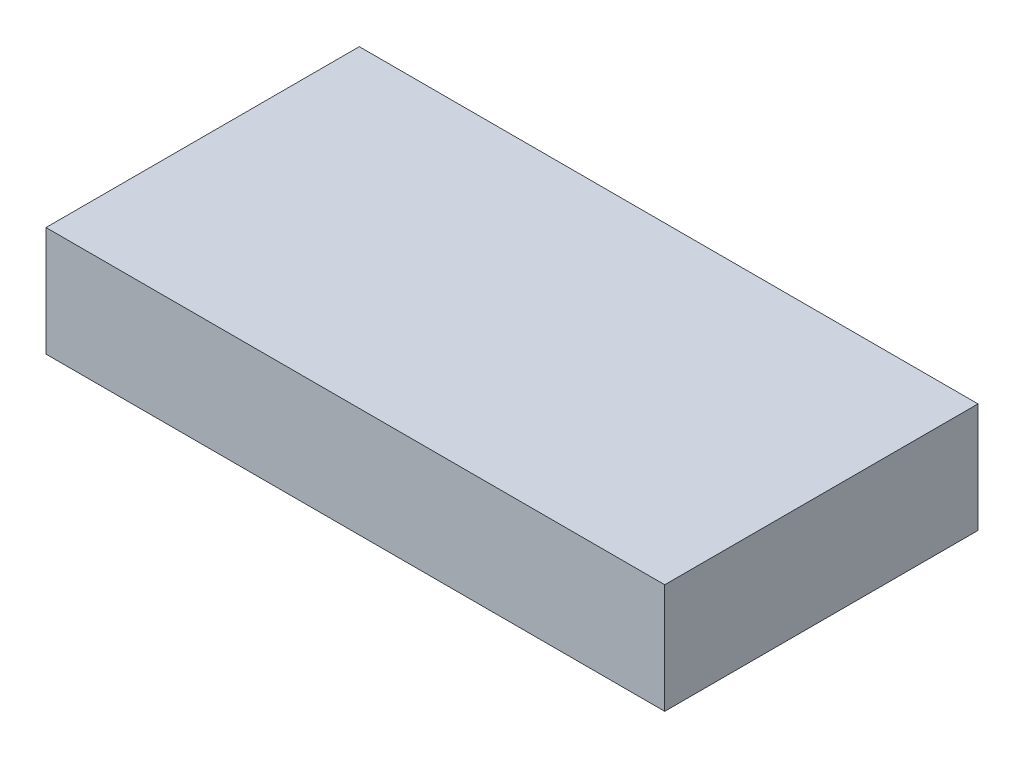
ISO-10303-21;
HEADER;
FILE_DESCRIPTION(('STEP AP214'),'2;1');
FILE_NAME('part.step','',(''),(''),'','','');
FILE_SCHEMA(('AUTOMOTIVE_DESIGN { 1 0 10303 214 1 1 1 1 }'));
ENDSEC;
DATA;
#1=APPLICATION_CONTEXT('core data for automotive mechanical design processes');
#2=APPLICATION_PROTOCOL_DEFINITION('international standard','automotive_design',2000,#1);
#3=PRODUCT_CONTEXT('',#1,'mechanical');
#4=PRODUCT('Part','Part','',(#3));
#5=PRODUCT_RELATED_PRODUCT_CATEGORY('part','',(#4));
#6=PRODUCT_DEFINITION_FORMATION('','',#4);
#7=PRODUCT_DEFINITION_CONTEXT('part definition',#1,'design');
#8=PRODUCT_DEFINITION('design','',#6,#7);
#9=PRODUCT_DEFINITION_SHAPE('','',#8);
#10=(LENGTH_UNIT() NAMED_UNIT(*) SI_UNIT(.MILLI.,.METRE.));
#11=(NAMED_UNIT(*) PLANE_ANGLE_UNIT() SI_UNIT($,.RADIAN.));
#12=(NAMED_UNIT(*) SI_UNIT($,.STERADIAN.) SOLID_ANGLE_UNIT());
#13=UNCERTAINTY_MEASURE_WITH_UNIT(LENGTH_MEASURE(1.E-05),#10,'distance_accuracy_value','');
#14=(GEOMETRIC_REPRESENTATION_CONTEXT(3) GLOBAL_UNCERTAINTY_ASSIGNED_CONTEXT((#13)) GLOBAL_UNIT_ASSIGNED_CONTEXT((#10,
#11,#12)) REPRESENTATION_CONTEXT('',''));
#15=CARTESIAN_POINT('',(0.,0.,0.));
#16=DIRECTION('',(0.,0.,1.));
#17=DIRECTION('',(1.,0.,0.));
#18=AXIS2_PLACEMENT_3D('',#15,#16,#17);
#19=CARTESIAN_POINT('',(-1.58,0.58,4.8092366693655));
#20=DIRECTION('',(1.,0.,0.));
#21=DIRECTION('',(0.,0.,-1.));
#22=AXIS2_PLACEMENT_3D('',#19,#20,#21);
#23=PLANE('',#22);
#24=DIRECTION('',(0.,-1.,0.));
#25=VECTOR('',#24,1.);
#26=CARTESIAN_POINT('',(-1.58,0.58,1.6));
#27=LINE('',#26,#25);
#28=CARTESIAN_POINT('',(-1.58,0.58,1.6));
#29=VERTEX_POINT('',#28);
#30=CARTESIAN_POINT('',(-1.58,0.0200000000000001,1.6));
#31=VERTEX_POINT('',#30);
#32=EDGE_CURVE('E11',#29,#31,#27,.T.);
#33=ORIENTED_EDGE('',*,*,#32,.F.);
#34=DIRECTION('',(0.,0.,-1.));
#35=VECTOR('',#34,1.);
#36=CARTESIAN_POINT('',(-1.58,0.58,4.8092366693655));
#37=LINE('',#36,#35);
#38=CARTESIAN_POINT('',(-1.58,0.58,0.));
#39=VERTEX_POINT('',#38);
#40=EDGE_CURVE('E24',#29,#39,#37,.T.);
#41=ORIENTED_EDGE('',*,*,#40,.T.);
#42=DIRECTION('',(0.,-1.,0.));
#43=VECTOR('',#42,1.);
#44=CARTESIAN_POINT('',(-1.58,0.58,0.));
#45=LINE('',#44,#43);
#46=CARTESIAN_POINT('',(-1.58,0.0200000000000001,0.));
#47=VERTEX_POINT('',#46);
#48=EDGE_CURVE('E75',#39,#47,#45,.T.);
#49=ORIENTED_EDGE('',*,*,#48,.T.);
#50=DIRECTION('',(0.,0.,-1.));
#51=VECTOR('',#50,1.);
#52=CARTESIAN_POINT('',(-1.58,0.0200000000000001,4.8092366693655));
#53=LINE('',#52,#51);
#54=EDGE_CURVE('E85',#31,#47,#53,.T.);
#55=ORIENTED_EDGE('',*,*,#54,.F.);
#56=EDGE_LOOP('',(#33,#41,#49,#55));
#57=FACE_BOUND('',#56,.T.);
#58=ADVANCED_FACE('F17',(#57),#23,.F.);
#59=CARTESIAN_POINT('',(-1.58,0.0200000000000001,4.8092366693655));
#60=DIRECTION('',(0.,1.,0.));
#61=DIRECTION('',(0.,0.,1.));
#62=AXIS2_PLACEMENT_3D('',#59,#60,#61);
#63=PLANE('',#62);
#64=DIRECTION('',(1.,0.,0.));
#65=VECTOR('',#64,1.);
#66=CARTESIAN_POINT('',(-1.58,0.0200000000000001,1.6));
#67=LINE('',#66,#65);
#68=CARTESIAN_POINT('',(1.58,0.0200000000000001,1.6));
#69=VERTEX_POINT('',#68);
#70=EDGE_CURVE('E83',#31,#69,#67,.T.);
#71=ORIENTED_EDGE('',*,*,#70,.F.);
#72=ORIENTED_EDGE('',*,*,#54,.T.);
#73=DIRECTION('',(1.,0.,0.));
#74=VECTOR('',#73,1.);
#75=CARTESIAN_POINT('',(-1.58,0.0200000000000001,0.));
#76=LINE('',#75,#74);
#77=CARTESIAN_POINT('',(1.58,0.0200000000000001,0.));
#78=VERTEX_POINT('',#77);
#79=EDGE_CURVE('E81',#47,#78,#76,.T.);
#80=ORIENTED_EDGE('',*,*,#79,.T.);
#81=DIRECTION('',(0.,0.,-1.));
#82=VECTOR('',#81,1.);
#83=CARTESIAN_POINT('',(1.58,0.0200000000000001,4.8092366693655));
#84=LINE('',#83,#82);
#85=EDGE_CURVE('E61',#69,#78,#84,.T.);
#86=ORIENTED_EDGE('',*,*,#85,.F.);
#87=EDGE_LOOP('',(#71,#72,#80,#86));
#88=FACE_BOUND('',#87,.T.);
#89=ADVANCED_FACE('F91',(#88),#63,.F.);
#90=CARTESIAN_POINT('',(1.58,0.58,4.8092366693655));
#91=DIRECTION('',(-1.,0.,0.));
#92=DIRECTION('',(0.,0.,1.));
#93=AXIS2_PLACEMENT_3D('',#90,#91,#92);
#94=PLANE('',#93);
#95=DIRECTION('',(0.,1.,0.));
#96=VECTOR('',#95,1.);
#97=CARTESIAN_POINT('',(1.58,0.58,1.6));
#98=LINE('',#97,#96);
#99=CARTESIAN_POINT('',(1.58,0.58,1.6));
#100=VERTEX_POINT('',#99);
#101=EDGE_CURVE('E65',#69,#100,#98,.T.);
#102=ORIENTED_EDGE('',*,*,#101,.F.);
#103=ORIENTED_EDGE('',*,*,#85,.T.);
#104=DIRECTION('',(0.,1.,0.));
#105=VECTOR('',#104,1.);
#106=CARTESIAN_POINT('',(1.58,0.58,0.));
#107=LINE('',#106,#105);
#108=CARTESIAN_POINT('',(1.58,0.58,0.));
#109=VERTEX_POINT('',#108);
#110=EDGE_CURVE('E54',#78,#109,#107,.T.);
#111=ORIENTED_EDGE('',*,*,#110,.T.);
#112=DIRECTION('',(0.,0.,-1.));
#113=VECTOR('',#112,1.);
#114=CARTESIAN_POINT('',(1.58,0.58,4.8092366693655));
#115=LINE('',#114,#113);
#116=EDGE_CURVE('E58',#100,#109,#115,.T.);
#117=ORIENTED_EDGE('',*,*,#116,.F.);
#118=EDGE_LOOP('',(#102,#103,#111,#117));
#119=FACE_BOUND('',#118,.T.);
#120=ADVANCED_FACE('F57',(#119),#94,.F.);
#121=CARTESIAN_POINT('',(-1.58,0.58,4.8092366693655));
#122=DIRECTION('',(0.,-1.,0.));
#123=DIRECTION('',(0.,0.,-1.));
#124=AXIS2_PLACEMENT_3D('',#121,#122,#123);
#125=PLANE('',#124);
#126=DIRECTION('',(-1.,0.,0.));
#127=VECTOR('',#126,1.);
#128=CARTESIAN_POINT('',(-1.58,0.58,1.6));
#129=LINE('',#128,#127);
#130=EDGE_CURVE('E71',#100,#29,#129,.T.);
#131=ORIENTED_EDGE('',*,*,#130,.F.);
#132=ORIENTED_EDGE('',*,*,#116,.T.);
#133=DIRECTION('',(-1.,0.,0.));
#134=VECTOR('',#133,1.);
#135=CARTESIAN_POINT('',(-1.58,0.58,0.));
#136=LINE('',#135,#134);
#137=EDGE_CURVE('E70',#109,#39,#136,.T.);
#138=ORIENTED_EDGE('',*,*,#137,.T.);
#139=ORIENTED_EDGE('',*,*,#40,.F.);
#140=EDGE_LOOP('',(#131,#132,#138,#139));
#141=FACE_BOUND('',#140,.T.);
#142=ADVANCED_FACE('F69',(#141),#125,.F.);
#143=CARTESIAN_POINT('',(-1.58,0.0200000000000001,0.));
#144=DIRECTION('',(0.,0.,1.));
#145=DIRECTION('',(1.,0.,0.));
#146=AXIS2_PLACEMENT_3D('',#143,#144,#145);
#147=PLANE('',#146);
#148=ORIENTED_EDGE('',*,*,#48,.F.);
#149=ORIENTED_EDGE('',*,*,#137,.F.);
#150=ORIENTED_EDGE('',*,*,#110,.F.);
#151=ORIENTED_EDGE('',*,*,#79,.F.);
#152=EDGE_LOOP('',(#148,#149,#150,#151));
#153=FACE_BOUND('',#152,.T.);
#154=ADVANCED_FACE('F74',(#153),#147,.F.);
#155=CARTESIAN_POINT('',(1.1,0.,1.6));
#156=DIRECTION('',(0.,0.,1.));
#157=DIRECTION('',(1.,0.,0.));
#158=AXIS2_PLACEMENT_3D('',#155,#156,#157);
#159=PLANE('',#158);
#160=ORIENTED_EDGE('',*,*,#130,.T.);
#161=ORIENTED_EDGE('',*,*,#32,.T.);
#162=ORIENTED_EDGE('',*,*,#70,.T.);
#163=ORIENTED_EDGE('',*,*,#101,.T.);
#164=EDGE_LOOP('',(#160,#161,#162,#163));
#165=FACE_BOUND('',#164,.T.);
#166=ADVANCED_FACE('F88',(#165),#159,.T.);
#167=CLOSED_SHELL('',(#58,#89,#120,#142,#154,#166));
#168=MANIFOLD_SOLID_BREP('B1',#167);
#169=ADVANCED_BREP_SHAPE_REPRESENTATION('',(#18,#168),#14);
#170=SHAPE_DEFINITION_REPRESENTATION(#9,#169);
ENDSEC;
END-ISO-10303-21;
